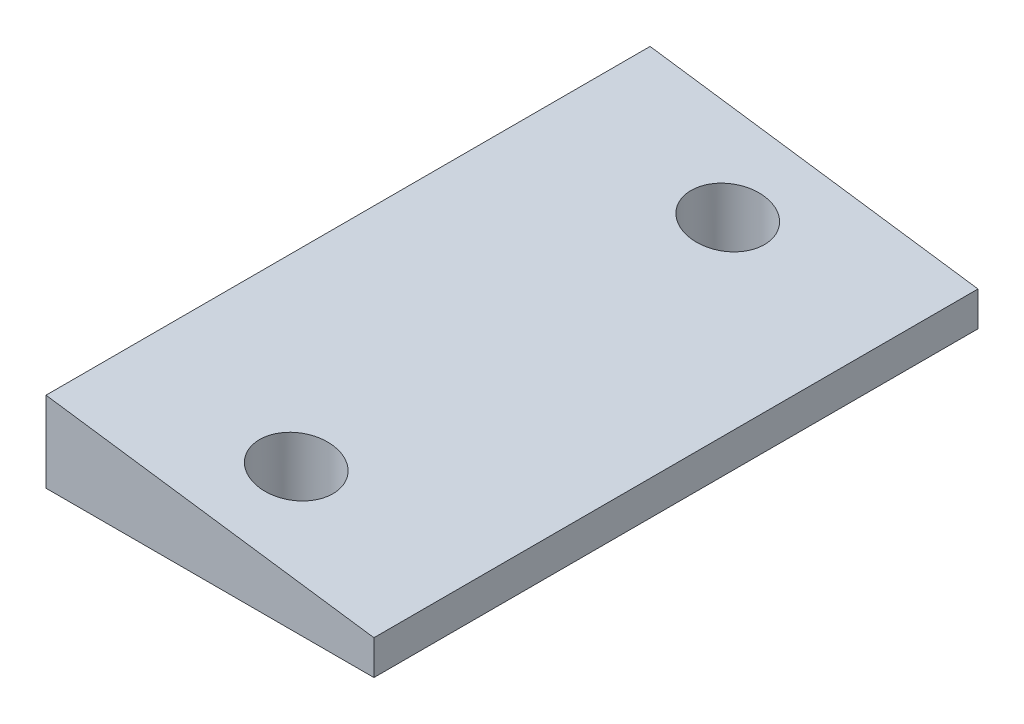
ISO-10303-21;
HEADER;
FILE_DESCRIPTION(('STEP AP214'),'2;1');
FILE_NAME('part.step','',(''),(''),'','','');
FILE_SCHEMA(('AUTOMOTIVE_DESIGN { 1 0 10303 214 1 1 1 1 }'));
ENDSEC;
DATA;
#1=APPLICATION_CONTEXT('core data for automotive mechanical design processes');
#2=APPLICATION_PROTOCOL_DEFINITION('international standard','automotive_design',2000,#1);
#3=PRODUCT_CONTEXT('',#1,'mechanical');
#4=PRODUCT('Part','Part','',(#3));
#5=PRODUCT_RELATED_PRODUCT_CATEGORY('part','',(#4));
#6=PRODUCT_DEFINITION_FORMATION('','',#4);
#7=PRODUCT_DEFINITION_CONTEXT('part definition',#1,'design');
#8=PRODUCT_DEFINITION('design','',#6,#7);
#9=PRODUCT_DEFINITION_SHAPE('','',#8);
#10=(LENGTH_UNIT() NAMED_UNIT(*) SI_UNIT(.MILLI.,.METRE.));
#11=(NAMED_UNIT(*) PLANE_ANGLE_UNIT() SI_UNIT($,.RADIAN.));
#12=(NAMED_UNIT(*) SI_UNIT($,.STERADIAN.) SOLID_ANGLE_UNIT());
#13=UNCERTAINTY_MEASURE_WITH_UNIT(LENGTH_MEASURE(1.E-05),#10,'distance_accuracy_value','');
#14=(GEOMETRIC_REPRESENTATION_CONTEXT(3) GLOBAL_UNCERTAINTY_ASSIGNED_CONTEXT((#13)) GLOBAL_UNIT_ASSIGNED_CONTEXT((#10,
#11,#12)) REPRESENTATION_CONTEXT('',''));
#15=CARTESIAN_POINT('',(0.,0.,0.));
#16=DIRECTION('',(0.,0.,1.));
#17=DIRECTION('',(1.,0.,0.));
#18=AXIS2_PLACEMENT_3D('',#15,#16,#17);
#19=CARTESIAN_POINT('',(21.4418011274785,-4.10342127464224,70.));
#20=DIRECTION('',(-1.,0.,0.));
#21=DIRECTION('',(0.,0.,1.));
#22=AXIS2_PLACEMENT_3D('',#19,#20,#21);
#23=PLANE('',#22);
#24=DIRECTION('',(0.,1.,0.));
#25=VECTOR('',#24,1.);
#26=CARTESIAN_POINT('',(21.4418011274785,-4.10342127464224,0.));
#27=LINE('',#26,#25);
#28=CARTESIAN_POINT('',(21.4418011274785,-4.10342127464224,0.));
#29=VERTEX_POINT('',#28);
#30=CARTESIAN_POINT('',(21.4418011274785,-0.103421274642241,0.));
#31=VERTEX_POINT('',#30);
#32=EDGE_CURVE('E99',#29,#31,#27,.T.);
#33=ORIENTED_EDGE('',*,*,#32,.T.);
#34=DIRECTION('',(0.,0.,-1.));
#35=VECTOR('',#34,1.);
#36=CARTESIAN_POINT('',(21.4418011274785,-0.103421274642241,70.));
#37=LINE('',#36,#35);
#38=CARTESIAN_POINT('',(21.4418011274785,-0.103421274642241,70.));
#39=VERTEX_POINT('',#38);
#40=EDGE_CURVE('E11',#39,#31,#37,.T.);
#41=ORIENTED_EDGE('',*,*,#40,.F.);
#42=DIRECTION('',(0.,1.,0.));
#43=VECTOR('',#42,1.);
#44=CARTESIAN_POINT('',(21.4418011274785,-4.10342127464224,70.));
#45=LINE('',#44,#43);
#46=CARTESIAN_POINT('',(21.4418011274785,-4.10342127464224,70.));
#47=VERTEX_POINT('',#46);
#48=EDGE_CURVE('E86',#47,#39,#45,.T.);
#49=ORIENTED_EDGE('',*,*,#48,.F.);
#50=DIRECTION('',(0.,0.,-1.));
#51=VECTOR('',#50,1.);
#52=CARTESIAN_POINT('',(21.4418011274785,-4.10342127464224,70.));
#53=LINE('',#52,#51);
#54=EDGE_CURVE('E95',#47,#29,#53,.T.);
#55=ORIENTED_EDGE('',*,*,#54,.T.);
#56=EDGE_LOOP('',(#33,#41,#49,#55));
#57=FACE_BOUND('',#56,.T.);
#58=ADVANCED_FACE('F33',(#57),#23,.F.);
#59=CARTESIAN_POINT('',(-16.5581988725215,5.23713044404864,70.));
#60=DIRECTION('',(-0.139173100960066,-0.99026806874157,0.));
#61=DIRECTION('',(0.99026806874157,-0.139173100960066,0.));
#62=AXIS2_PLACEMENT_3D('',#59,#60,#61);
#63=PLANE('',#62);
#64=CARTESIAN_POINT('',(2.4418011274785,2.5668545847032,60.));
#65=DIRECTION('',(-0.139173100960066,-0.99026806874157,0.));
#66=DIRECTION('',(-0.99026806874157,0.139173100960066,0.));
#67=AXIS2_PLACEMENT_3D('',#64,#65,#66);
#68=ELLIPSE('',#67,4.29176718320413,4.25);
#69=CARTESIAN_POINT('',(-1.8081988725215,3.16415313218836,60.));
#70=VERTEX_POINT('',#69);
#71=EDGE_CURVE('E102',#70,#70,#68,.F.);
#72=ORIENTED_EDGE('',*,*,#71,.F.);
#73=EDGE_LOOP('',(#72));
#74=FACE_BOUND('',#73,.T.);
#75=CARTESIAN_POINT('',(2.4418011274785,2.5668545847032,10.));
#76=DIRECTION('',(-0.139173100960066,-0.99026806874157,0.));
#77=DIRECTION('',(-0.99026806874157,0.139173100960066,0.));
#78=AXIS2_PLACEMENT_3D('',#75,#76,#77);
#79=ELLIPSE('',#78,4.29176718320413,4.25);
#80=CARTESIAN_POINT('',(-1.8081988725215,3.16415313218836,10.));
#81=VERTEX_POINT('',#80);
#82=EDGE_CURVE('E109',#81,#81,#79,.F.);
#83=ORIENTED_EDGE('',*,*,#82,.F.);
#84=EDGE_LOOP('',(#83));
#85=FACE_BOUND('',#84,.T.);
#86=DIRECTION('',(-0.99026806874157,0.139173100960066,0.));
#87=VECTOR('',#86,1.);
#88=CARTESIAN_POINT('',(-16.5581988725215,5.23713044404864,0.));
#89=LINE('',#88,#87);
#90=CARTESIAN_POINT('',(-16.5581988725215,5.23713044404864,0.));
#91=VERTEX_POINT('',#90);
#92=EDGE_CURVE('E90',#31,#91,#89,.T.);
#93=ORIENTED_EDGE('',*,*,#92,.T.);
#94=DIRECTION('',(0.,0.,-1.));
#95=VECTOR('',#94,1.);
#96=CARTESIAN_POINT('',(-16.5581988725215,5.23713044404864,70.));
#97=LINE('',#96,#95);
#98=CARTESIAN_POINT('',(-16.5581988725215,5.23713044404864,70.));
#99=VERTEX_POINT('',#98);
#100=EDGE_CURVE('E42',#99,#91,#97,.T.);
#101=ORIENTED_EDGE('',*,*,#100,.F.);
#102=DIRECTION('',(-0.99026806874157,0.139173100960066,0.));
#103=VECTOR('',#102,1.);
#104=CARTESIAN_POINT('',(-16.5581988725215,5.23713044404864,70.));
#105=LINE('',#104,#103);
#106=EDGE_CURVE('E81',#39,#99,#105,.T.);
#107=ORIENTED_EDGE('',*,*,#106,.F.);
#108=ORIENTED_EDGE('',*,*,#40,.T.);
#109=EDGE_LOOP('',(#93,#101,#107,#108));
#110=FACE_BOUND('',#109,.T.);
#111=ADVANCED_FACE('F89',(#74,#85,#110),#63,.F.);
#112=CARTESIAN_POINT('',(-16.5581988725215,5.23713044404864,70.));
#113=DIRECTION('',(1.,0.,0.));
#114=DIRECTION('',(0.,0.,-1.));
#115=AXIS2_PLACEMENT_3D('',#112,#113,#114);
#116=PLANE('',#115);
#117=DIRECTION('',(0.,-1.,0.));
#118=VECTOR('',#117,1.);
#119=CARTESIAN_POINT('',(-16.5581988725215,5.23713044404864,0.));
#120=LINE('',#119,#118);
#121=CARTESIAN_POINT('',(-16.5581988725215,-4.10342127464224,0.));
#122=VERTEX_POINT('',#121);
#123=EDGE_CURVE('E68',#91,#122,#120,.T.);
#124=ORIENTED_EDGE('',*,*,#123,.T.);
#125=DIRECTION('',(0.,0.,-1.));
#126=VECTOR('',#125,1.);
#127=CARTESIAN_POINT('',(-16.5581988725215,-4.10342127464224,70.));
#128=LINE('',#127,#126);
#129=CARTESIAN_POINT('',(-16.5581988725215,-4.10342127464224,70.));
#130=VERTEX_POINT('',#129);
#131=EDGE_CURVE('E91',#130,#122,#128,.T.);
#132=ORIENTED_EDGE('',*,*,#131,.F.);
#133=DIRECTION('',(0.,-1.,0.));
#134=VECTOR('',#133,1.);
#135=CARTESIAN_POINT('',(-16.5581988725215,5.23713044404864,70.));
#136=LINE('',#135,#134);
#137=EDGE_CURVE('E84',#99,#130,#136,.T.);
#138=ORIENTED_EDGE('',*,*,#137,.F.);
#139=ORIENTED_EDGE('',*,*,#100,.T.);
#140=EDGE_LOOP('',(#124,#132,#138,#139));
#141=FACE_BOUND('',#140,.T.);
#142=ADVANCED_FACE('F93',(#141),#116,.F.);
#143=CARTESIAN_POINT('',(-16.5581988725215,-4.10342127464224,70.));
#144=DIRECTION('',(0.,1.,0.));
#145=DIRECTION('',(0.,0.,1.));
#146=AXIS2_PLACEMENT_3D('',#143,#144,#145);
#147=PLANE('',#146);
#148=CARTESIAN_POINT('',(2.4418011274785,-4.10342127464224,60.));
#149=DIRECTION('',(0.,1.,0.));
#150=DIRECTION('',(0.,0.,1.));
#151=AXIS2_PLACEMENT_3D('',#148,#149,#150);
#152=CIRCLE('',#151,4.25);
#153=CARTESIAN_POINT('',(2.4418011274785,-4.10342127464224,64.25));
#154=VERTEX_POINT('',#153);
#155=EDGE_CURVE('E36',#154,#154,#152,.F.);
#156=ORIENTED_EDGE('',*,*,#155,.F.);
#157=EDGE_LOOP('',(#156));
#158=FACE_BOUND('',#157,.T.);
#159=CARTESIAN_POINT('',(2.4418011274785,-4.10342127464224,10.));
#160=DIRECTION('',(0.,1.,0.));
#161=DIRECTION('',(0.,0.,1.));
#162=AXIS2_PLACEMENT_3D('',#159,#160,#161);
#163=CIRCLE('',#162,4.25);
#164=CARTESIAN_POINT('',(2.4418011274785,-4.10342127464224,14.25));
#165=VERTEX_POINT('',#164);
#166=EDGE_CURVE('E107',#165,#165,#163,.F.);
#167=ORIENTED_EDGE('',*,*,#166,.F.);
#168=EDGE_LOOP('',(#167));
#169=FACE_BOUND('',#168,.T.);
#170=DIRECTION('',(1.,0.,0.));
#171=VECTOR('',#170,1.);
#172=CARTESIAN_POINT('',(-16.5581988725215,-4.10342127464224,0.));
#173=LINE('',#172,#171);
#174=EDGE_CURVE('E74',#122,#29,#173,.T.);
#175=ORIENTED_EDGE('',*,*,#174,.T.);
#176=ORIENTED_EDGE('',*,*,#54,.F.);
#177=DIRECTION('',(1.,0.,0.));
#178=VECTOR('',#177,1.);
#179=CARTESIAN_POINT('',(-16.5581988725215,-4.10342127464224,70.));
#180=LINE('',#179,#178);
#181=EDGE_CURVE('E51',#130,#47,#180,.T.);
#182=ORIENTED_EDGE('',*,*,#181,.F.);
#183=ORIENTED_EDGE('',*,*,#131,.T.);
#184=EDGE_LOOP('',(#175,#176,#182,#183));
#185=FACE_BOUND('',#184,.T.);
#186=ADVANCED_FACE('F129',(#158,#169,#185),#147,.F.);
#187=CARTESIAN_POINT('',(0.,0.,70.));
#188=DIRECTION('',(0.,0.,-1.));
#189=DIRECTION('',(-1.,0.,0.));
#190=AXIS2_PLACEMENT_3D('',#187,#188,#189);
#191=PLANE('',#190);
#192=ORIENTED_EDGE('',*,*,#48,.T.);
#193=ORIENTED_EDGE('',*,*,#106,.T.);
#194=ORIENTED_EDGE('',*,*,#137,.T.);
#195=ORIENTED_EDGE('',*,*,#181,.T.);
#196=EDGE_LOOP('',(#192,#193,#194,#195));
#197=FACE_BOUND('',#196,.T.);
#198=ADVANCED_FACE('F82',(#197),#191,.F.);
#199=CARTESIAN_POINT('',(0.,0.,0.));
#200=DIRECTION('',(0.,0.,-1.));
#201=DIRECTION('',(-1.,0.,0.));
#202=AXIS2_PLACEMENT_3D('',#199,#200,#201);
#203=PLANE('',#202);
#204=ORIENTED_EDGE('',*,*,#32,.F.);
#205=ORIENTED_EDGE('',*,*,#174,.F.);
#206=ORIENTED_EDGE('',*,*,#123,.F.);
#207=ORIENTED_EDGE('',*,*,#92,.F.);
#208=EDGE_LOOP('',(#204,#205,#206,#207));
#209=FACE_BOUND('',#208,.T.);
#210=ADVANCED_FACE('F136',(#209),#203,.T.);
#211=CARTESIAN_POINT('',(2.4418011274785,-4.76286955595136,10.));
#212=DIRECTION('',(0.,1.,0.));
#213=DIRECTION('',(0.,0.,1.));
#214=AXIS2_PLACEMENT_3D('',#211,#212,#213);
#215=CYLINDRICAL_SURFACE('',#214,4.25);
#216=ORIENTED_EDGE('',*,*,#166,.T.);
#217=EDGE_LOOP('',(#216));
#218=FACE_BOUND('',#217,.T.);
#219=ORIENTED_EDGE('',*,*,#82,.T.);
#220=EDGE_LOOP('',(#219));
#221=FACE_BOUND('',#220,.T.);
#222=ADVANCED_FACE('F139',(#218,#221),#215,.F.);
#223=CARTESIAN_POINT('',(2.4418011274785,-4.76286955595136,60.));
#224=DIRECTION('',(0.,1.,0.));
#225=DIRECTION('',(0.,0.,1.));
#226=AXIS2_PLACEMENT_3D('',#223,#224,#225);
#227=CYLINDRICAL_SURFACE('',#226,4.25);
#228=ORIENTED_EDGE('',*,*,#155,.T.);
#229=EDGE_LOOP('',(#228));
#230=FACE_BOUND('',#229,.T.);
#231=ORIENTED_EDGE('',*,*,#71,.T.);
#232=EDGE_LOOP('',(#231));
#233=FACE_BOUND('',#232,.T.);
#234=ADVANCED_FACE('F121',(#230,#233),#227,.F.);
#235=CLOSED_SHELL('',(#58,#111,#142,#186,#198,#210,#222,#234));
#236=MANIFOLD_SOLID_BREP('B2',#235);
#237=ADVANCED_BREP_SHAPE_REPRESENTATION('',(#18,#236),#14);
#238=SHAPE_DEFINITION_REPRESENTATION(#9,#237);
ENDSEC;
END-ISO-10303-21;
